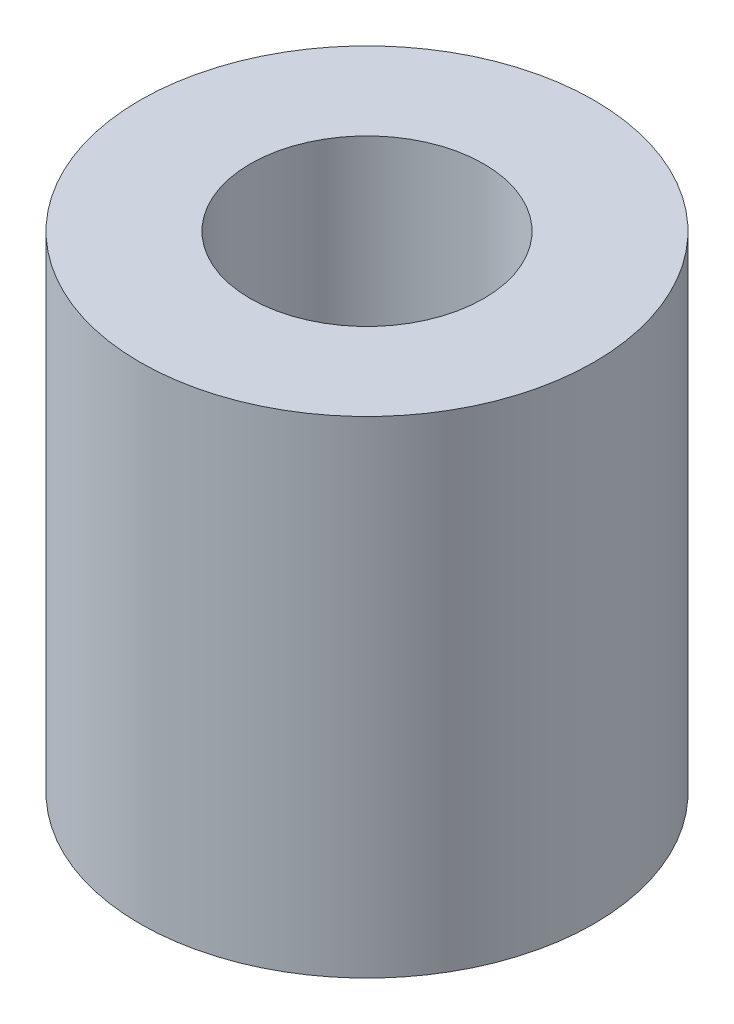
ISO-10303-21;
HEADER;
FILE_DESCRIPTION(('STEP AP214'),'2;1');
FILE_NAME('part.step','',(''),(''),'','','');
FILE_SCHEMA(('AUTOMOTIVE_DESIGN { 1 0 10303 214 1 1 1 1 }'));
ENDSEC;
DATA;
#1=APPLICATION_CONTEXT('core data for automotive mechanical design processes');
#2=APPLICATION_PROTOCOL_DEFINITION('international standard','automotive_design',2000,#1);
#3=PRODUCT_CONTEXT('',#1,'mechanical');
#4=PRODUCT('Part','Part','',(#3));
#5=PRODUCT_RELATED_PRODUCT_CATEGORY('part','',(#4));
#6=PRODUCT_DEFINITION_FORMATION('','',#4);
#7=PRODUCT_DEFINITION_CONTEXT('part definition',#1,'design');
#8=PRODUCT_DEFINITION('design','',#6,#7);
#9=PRODUCT_DEFINITION_SHAPE('','',#8);
#10=(LENGTH_UNIT() NAMED_UNIT(*) SI_UNIT(.MILLI.,.METRE.));
#11=(NAMED_UNIT(*) PLANE_ANGLE_UNIT() SI_UNIT($,.RADIAN.));
#12=(NAMED_UNIT(*) SI_UNIT($,.STERADIAN.) SOLID_ANGLE_UNIT());
#13=UNCERTAINTY_MEASURE_WITH_UNIT(LENGTH_MEASURE(1.E-05),#10,'distance_accuracy_value','');
#14=(GEOMETRIC_REPRESENTATION_CONTEXT(3) GLOBAL_UNCERTAINTY_ASSIGNED_CONTEXT((#13)) GLOBAL_UNIT_ASSIGNED_CONTEXT((#10,
#11,#12)) REPRESENTATION_CONTEXT('',''));
#15=CARTESIAN_POINT('',(0.,0.,0.));
#16=DIRECTION('',(0.,0.,1.));
#17=DIRECTION('',(1.,0.,0.));
#18=AXIS2_PLACEMENT_3D('',#15,#16,#17);
#19=CARTESIAN_POINT('',(0.,7.5,0.));
#20=DIRECTION('',(0.,1.,0.));
#21=DIRECTION('',(0.,0.,1.));
#22=AXIS2_PLACEMENT_3D('',#19,#20,#21);
#23=PLANE('',#22);
#24=CARTESIAN_POINT('',(0.,7.5,0.));
#25=DIRECTION('',(0.,1.,0.));
#26=DIRECTION('',(0.,0.,1.));
#27=AXIS2_PLACEMENT_3D('',#24,#25,#26);
#28=CIRCLE('',#27,3.5);
#29=CARTESIAN_POINT('',(0.,7.5,3.5));
#30=VERTEX_POINT('',#29);
#31=EDGE_CURVE('E10',#30,#30,#28,.T.);
#32=ORIENTED_EDGE('',*,*,#31,.T.);
#33=EDGE_LOOP('',(#32));
#34=FACE_BOUND('',#33,.T.);
#35=CARTESIAN_POINT('',(0.,7.5,0.));
#36=DIRECTION('',(0.,1.,0.));
#37=DIRECTION('',(0.,0.,1.));
#38=AXIS2_PLACEMENT_3D('',#35,#36,#37);
#39=CIRCLE('',#38,1.8);
#40=CARTESIAN_POINT('',(0.,7.5,1.8));
#41=VERTEX_POINT('',#40);
#42=EDGE_CURVE('E25',#41,#41,#39,.T.);
#43=ORIENTED_EDGE('',*,*,#42,.F.);
#44=EDGE_LOOP('',(#43));
#45=FACE_BOUND('',#44,.T.);
#46=ADVANCED_FACE('F14',(#34,#45),#23,.T.);
#47=CARTESIAN_POINT('',(0.,0.,0.));
#48=DIRECTION('',(0.,1.,0.));
#49=DIRECTION('',(0.,0.,1.));
#50=AXIS2_PLACEMENT_3D('',#47,#48,#49);
#51=PLANE('',#50);
#52=CARTESIAN_POINT('',(0.,0.,0.));
#53=DIRECTION('',(0.,1.,0.));
#54=DIRECTION('',(0.,0.,1.));
#55=AXIS2_PLACEMENT_3D('',#52,#53,#54);
#56=CIRCLE('',#55,3.5);
#57=CARTESIAN_POINT('',(0.,0.,3.5));
#58=VERTEX_POINT('',#57);
#59=EDGE_CURVE('E18',#58,#58,#56,.T.);
#60=ORIENTED_EDGE('',*,*,#59,.F.);
#61=EDGE_LOOP('',(#60));
#62=FACE_BOUND('',#61,.T.);
#63=CARTESIAN_POINT('',(0.,0.,0.));
#64=DIRECTION('',(0.,1.,0.));
#65=DIRECTION('',(0.,0.,1.));
#66=AXIS2_PLACEMENT_3D('',#63,#64,#65);
#67=CIRCLE('',#66,1.8);
#68=CARTESIAN_POINT('',(0.,0.,1.8));
#69=VERTEX_POINT('',#68);
#70=EDGE_CURVE('E27',#69,#69,#67,.T.);
#71=ORIENTED_EDGE('',*,*,#70,.T.);
#72=EDGE_LOOP('',(#71));
#73=FACE_BOUND('',#72,.T.);
#74=ADVANCED_FACE('F37',(#62,#73),#51,.F.);
#75=CARTESIAN_POINT('',(0.,7.5,0.));
#76=DIRECTION('',(0.,-1.,0.));
#77=DIRECTION('',(0.,0.,-1.));
#78=AXIS2_PLACEMENT_3D('',#75,#76,#77);
#79=CYLINDRICAL_SURFACE('',#78,3.5);
#80=ORIENTED_EDGE('',*,*,#31,.F.);
#81=EDGE_LOOP('',(#80));
#82=FACE_BOUND('',#81,.T.);
#83=ORIENTED_EDGE('',*,*,#59,.T.);
#84=EDGE_LOOP('',(#83));
#85=FACE_BOUND('',#84,.T.);
#86=ADVANCED_FACE('F16',(#82,#85),#79,.T.);
#87=CARTESIAN_POINT('',(0.,7.5,0.));
#88=DIRECTION('',(0.,-1.,0.));
#89=DIRECTION('',(0.,0.,-1.));
#90=AXIS2_PLACEMENT_3D('',#87,#88,#89);
#91=CYLINDRICAL_SURFACE('',#90,1.8);
#92=ORIENTED_EDGE('',*,*,#42,.T.);
#93=EDGE_LOOP('',(#92));
#94=FACE_BOUND('',#93,.T.);
#95=ORIENTED_EDGE('',*,*,#70,.F.);
#96=EDGE_LOOP('',(#95));
#97=FACE_BOUND('',#96,.T.);
#98=ADVANCED_FACE('F33',(#94,#97),#91,.F.);
#99=CLOSED_SHELL('',(#46,#74,#86,#98));
#100=MANIFOLD_SOLID_BREP('B1',#99);
#101=ADVANCED_BREP_SHAPE_REPRESENTATION('',(#18,#100),#14);
#102=SHAPE_DEFINITION_REPRESENTATION(#9,#101);
ENDSEC;
END-ISO-10303-21;
